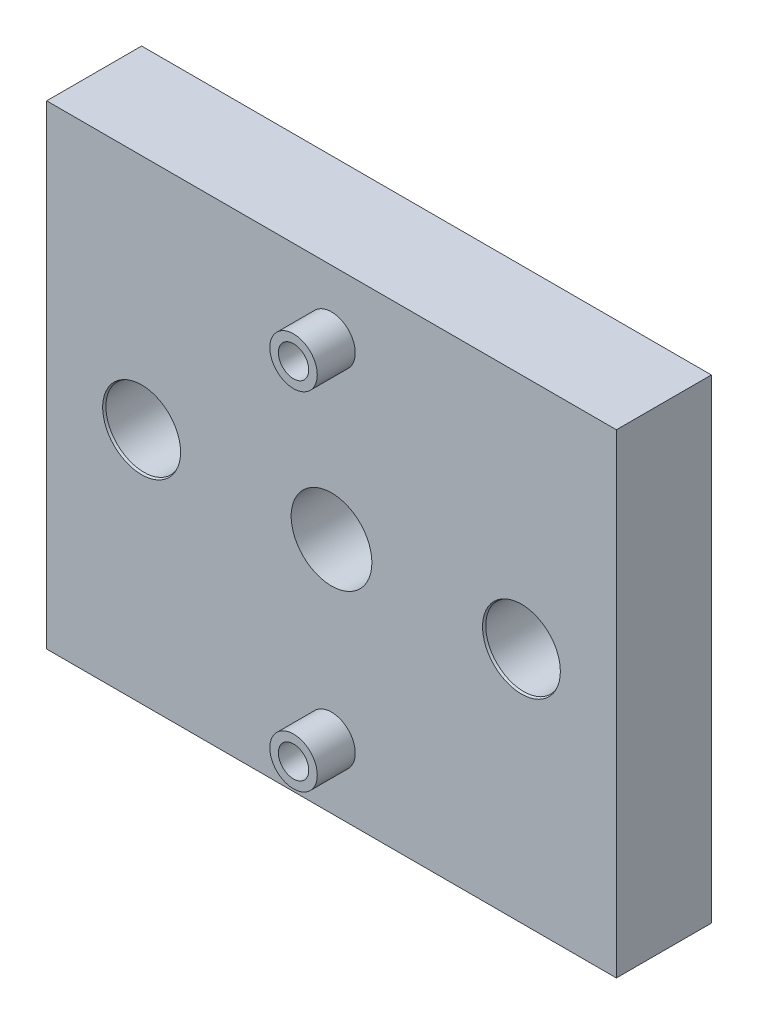
ISO-10303-21;
HEADER;
FILE_DESCRIPTION(('STEP AP214'),'2;1');
FILE_NAME('part.step','',(''),(''),'','','');
FILE_SCHEMA(('AUTOMOTIVE_DESIGN { 1 0 10303 214 1 1 1 1 }'));
ENDSEC;
DATA;
#1=APPLICATION_CONTEXT('core data for automotive mechanical design processes');
#2=APPLICATION_PROTOCOL_DEFINITION('international standard','automotive_design',2000,#1);
#3=PRODUCT_CONTEXT('',#1,'mechanical');
#4=PRODUCT('Part','Part','',(#3));
#5=PRODUCT_RELATED_PRODUCT_CATEGORY('part','',(#4));
#6=PRODUCT_DEFINITION_FORMATION('','',#4);
#7=PRODUCT_DEFINITION_CONTEXT('part definition',#1,'design');
#8=PRODUCT_DEFINITION('design','',#6,#7);
#9=PRODUCT_DEFINITION_SHAPE('','',#8);
#10=(LENGTH_UNIT() NAMED_UNIT(*) SI_UNIT(.MILLI.,.METRE.));
#11=(NAMED_UNIT(*) PLANE_ANGLE_UNIT() SI_UNIT($,.RADIAN.));
#12=(NAMED_UNIT(*) SI_UNIT($,.STERADIAN.) SOLID_ANGLE_UNIT());
#13=UNCERTAINTY_MEASURE_WITH_UNIT(LENGTH_MEASURE(1.E-05),#10,'distance_accuracy_value','');
#14=(GEOMETRIC_REPRESENTATION_CONTEXT(3) GLOBAL_UNCERTAINTY_ASSIGNED_CONTEXT((#13)) GLOBAL_UNIT_ASSIGNED_CONTEXT((#10,
#11,#12)) REPRESENTATION_CONTEXT('',''));
#15=CARTESIAN_POINT('',(0.,0.,0.));
#16=DIRECTION('',(0.,0.,1.));
#17=DIRECTION('',(1.,0.,0.));
#18=AXIS2_PLACEMENT_3D('',#15,#16,#17);
#19=CARTESIAN_POINT('',(30.,-25.,10.));
#20=DIRECTION('',(-1.,0.,0.));
#21=DIRECTION('',(0.,0.,1.));
#22=AXIS2_PLACEMENT_3D('',#19,#20,#21);
#23=PLANE('',#22);
#24=DIRECTION('',(0.,1.,0.));
#25=VECTOR('',#24,1.);
#26=CARTESIAN_POINT('',(30.,-25.,0.));
#27=LINE('',#26,#25);
#28=CARTESIAN_POINT('',(30.,-25.,0.));
#29=VERTEX_POINT('',#28);
#30=CARTESIAN_POINT('',(30.,25.,0.));
#31=VERTEX_POINT('',#30);
#32=EDGE_CURVE('E111',#29,#31,#27,.T.);
#33=ORIENTED_EDGE('',*,*,#32,.T.);
#34=DIRECTION('',(0.,0.,-1.));
#35=VECTOR('',#34,1.);
#36=CARTESIAN_POINT('',(30.,25.,10.));
#37=LINE('',#36,#35);
#38=CARTESIAN_POINT('',(30.,25.,10.));
#39=VERTEX_POINT('',#38);
#40=EDGE_CURVE('E100',#39,#31,#37,.T.);
#41=ORIENTED_EDGE('',*,*,#40,.F.);
#42=DIRECTION('',(0.,1.,0.));
#43=VECTOR('',#42,1.);
#44=CARTESIAN_POINT('',(30.,-25.,10.));
#45=LINE('',#44,#43);
#46=CARTESIAN_POINT('',(30.,-25.,10.));
#47=VERTEX_POINT('',#46);
#48=EDGE_CURVE('E92',#47,#39,#45,.T.);
#49=ORIENTED_EDGE('',*,*,#48,.F.);
#50=DIRECTION('',(0.,0.,-1.));
#51=VECTOR('',#50,1.);
#52=CARTESIAN_POINT('',(30.,-25.,10.));
#53=LINE('',#52,#51);
#54=EDGE_CURVE('E107',#47,#29,#53,.T.);
#55=ORIENTED_EDGE('',*,*,#54,.T.);
#56=EDGE_LOOP('',(#33,#41,#49,#55));
#57=FACE_BOUND('',#56,.T.);
#58=ADVANCED_FACE('F39',(#57),#23,.F.);
#59=CARTESIAN_POINT('',(-30.,25.,10.));
#60=DIRECTION('',(0.,-1.,0.));
#61=DIRECTION('',(0.,0.,-1.));
#62=AXIS2_PLACEMENT_3D('',#59,#60,#61);
#63=PLANE('',#62);
#64=DIRECTION('',(-1.,0.,0.));
#65=VECTOR('',#64,1.);
#66=CARTESIAN_POINT('',(-30.,25.,0.));
#67=LINE('',#66,#65);
#68=CARTESIAN_POINT('',(-30.,25.,0.));
#69=VERTEX_POINT('',#68);
#70=EDGE_CURVE('E98',#31,#69,#67,.T.);
#71=ORIENTED_EDGE('',*,*,#70,.T.);
#72=DIRECTION('',(0.,0.,-1.));
#73=VECTOR('',#72,1.);
#74=CARTESIAN_POINT('',(-30.,25.,10.));
#75=LINE('',#74,#73);
#76=CARTESIAN_POINT('',(-30.,25.,10.));
#77=VERTEX_POINT('',#76);
#78=EDGE_CURVE('E96',#77,#69,#75,.T.);
#79=ORIENTED_EDGE('',*,*,#78,.F.);
#80=DIRECTION('',(-1.,0.,0.));
#81=VECTOR('',#80,1.);
#82=CARTESIAN_POINT('',(-30.,25.,10.));
#83=LINE('',#82,#81);
#84=EDGE_CURVE('E87',#39,#77,#83,.T.);
#85=ORIENTED_EDGE('',*,*,#84,.F.);
#86=ORIENTED_EDGE('',*,*,#40,.T.);
#87=EDGE_LOOP('',(#71,#79,#85,#86));
#88=FACE_BOUND('',#87,.T.);
#89=ADVANCED_FACE('F97',(#88),#63,.F.);
#90=CARTESIAN_POINT('',(-30.,-25.,10.));
#91=DIRECTION('',(1.,0.,0.));
#92=DIRECTION('',(0.,0.,-1.));
#93=AXIS2_PLACEMENT_3D('',#90,#91,#92);
#94=PLANE('',#93);
#95=DIRECTION('',(0.,-1.,0.));
#96=VECTOR('',#95,1.);
#97=CARTESIAN_POINT('',(-30.,-25.,0.));
#98=LINE('',#97,#96);
#99=CARTESIAN_POINT('',(-30.,-25.,0.));
#100=VERTEX_POINT('',#99);
#101=EDGE_CURVE('E73',#69,#100,#98,.T.);
#102=ORIENTED_EDGE('',*,*,#101,.T.);
#103=DIRECTION('',(0.,0.,-1.));
#104=VECTOR('',#103,1.);
#105=CARTESIAN_POINT('',(-30.,-25.,10.));
#106=LINE('',#105,#104);
#107=CARTESIAN_POINT('',(-30.,-25.,10.));
#108=VERTEX_POINT('',#107);
#109=EDGE_CURVE('E101',#108,#100,#106,.T.);
#110=ORIENTED_EDGE('',*,*,#109,.F.);
#111=DIRECTION('',(0.,-1.,0.));
#112=VECTOR('',#111,1.);
#113=CARTESIAN_POINT('',(-30.,-25.,10.));
#114=LINE('',#113,#112);
#115=EDGE_CURVE('E90',#77,#108,#114,.T.);
#116=ORIENTED_EDGE('',*,*,#115,.F.);
#117=ORIENTED_EDGE('',*,*,#78,.T.);
#118=EDGE_LOOP('',(#102,#110,#116,#117));
#119=FACE_BOUND('',#118,.T.);
#120=ADVANCED_FACE('F103',(#119),#94,.F.);
#121=CARTESIAN_POINT('',(-30.,-25.,10.));
#122=DIRECTION('',(0.,1.,0.));
#123=DIRECTION('',(0.,0.,1.));
#124=AXIS2_PLACEMENT_3D('',#121,#122,#123);
#125=PLANE('',#124);
#126=DIRECTION('',(1.,0.,0.));
#127=VECTOR('',#126,1.);
#128=CARTESIAN_POINT('',(-30.,-25.,0.));
#129=LINE('',#128,#127);
#130=EDGE_CURVE('E79',#100,#29,#129,.T.);
#131=ORIENTED_EDGE('',*,*,#130,.T.);
#132=ORIENTED_EDGE('',*,*,#54,.F.);
#133=DIRECTION('',(1.,0.,0.));
#134=VECTOR('',#133,1.);
#135=CARTESIAN_POINT('',(-30.,-25.,10.));
#136=LINE('',#135,#134);
#137=EDGE_CURVE('E56',#108,#47,#136,.T.);
#138=ORIENTED_EDGE('',*,*,#137,.F.);
#139=ORIENTED_EDGE('',*,*,#109,.T.);
#140=EDGE_LOOP('',(#131,#132,#138,#139));
#141=FACE_BOUND('',#140,.T.);
#142=ADVANCED_FACE('F136',(#141),#125,.F.);
#143=CARTESIAN_POINT('',(0.,0.,10.));
#144=DIRECTION('',(0.,0.,-1.));
#145=DIRECTION('',(-1.,0.,0.));
#146=AXIS2_PLACEMENT_3D('',#143,#144,#145);
#147=PLANE('',#146);
#148=CARTESIAN_POINT('',(0.,-18.25,10.));
#149=DIRECTION('',(0.,0.,-1.));
#150=DIRECTION('',(-1.,0.,0.));
#151=AXIS2_PLACEMENT_3D('',#148,#149,#150);
#152=CIRCLE('',#151,2.5);
#153=CARTESIAN_POINT('',(-2.5,-18.25,10.));
#154=VERTEX_POINT('',#153);
#155=EDGE_CURVE('E11',#154,#154,#152,.F.);
#156=ORIENTED_EDGE('',*,*,#155,.F.);
#157=EDGE_LOOP('',(#156));
#158=FACE_BOUND('',#157,.T.);
#159=CARTESIAN_POINT('',(0.,18.25,10.));
#160=DIRECTION('',(0.,0.,-1.));
#161=DIRECTION('',(-1.,0.,0.));
#162=AXIS2_PLACEMENT_3D('',#159,#160,#161);
#163=CIRCLE('',#162,2.5);
#164=CARTESIAN_POINT('',(-2.5,18.25,10.));
#165=VERTEX_POINT('',#164);
#166=EDGE_CURVE('E48',#165,#165,#163,.F.);
#167=ORIENTED_EDGE('',*,*,#166,.F.);
#168=EDGE_LOOP('',(#167));
#169=FACE_BOUND('',#168,.T.);
#170=CARTESIAN_POINT('',(20.,0.,10.));
#171=DIRECTION('',(0.,0.,1.));
#172=DIRECTION('',(1.,0.,0.));
#173=AXIS2_PLACEMENT_3D('',#170,#171,#172);
#174=CIRCLE('',#173,4.1);
#175=CARTESIAN_POINT('',(24.1,0.,10.));
#176=VERTEX_POINT('',#175);
#177=EDGE_CURVE('E142',#176,#176,#174,.T.);
#178=ORIENTED_EDGE('',*,*,#177,.F.);
#179=EDGE_LOOP('',(#178));
#180=FACE_BOUND('',#179,.T.);
#181=CARTESIAN_POINT('',(-20.,0.,10.));
#182=DIRECTION('',(0.,0.,1.));
#183=DIRECTION('',(1.,0.,0.));
#184=AXIS2_PLACEMENT_3D('',#181,#182,#183);
#185=CIRCLE('',#184,4.1);
#186=CARTESIAN_POINT('',(-15.9,0.,10.));
#187=VERTEX_POINT('',#186);
#188=EDGE_CURVE('E146',#187,#187,#185,.T.);
#189=ORIENTED_EDGE('',*,*,#188,.F.);
#190=EDGE_LOOP('',(#189));
#191=FACE_BOUND('',#190,.T.);
#192=CARTESIAN_POINT('',(0.,0.,10.));
#193=DIRECTION('',(0.,0.,1.));
#194=DIRECTION('',(1.,0.,0.));
#195=AXIS2_PLACEMENT_3D('',#192,#193,#194);
#196=CIRCLE('',#195,4.25000000000002);
#197=CARTESIAN_POINT('',(4.25000000000002,0.,10.));
#198=VERTEX_POINT('',#197);
#199=EDGE_CURVE('E149',#198,#198,#196,.T.);
#200=ORIENTED_EDGE('',*,*,#199,.F.);
#201=EDGE_LOOP('',(#200));
#202=FACE_BOUND('',#201,.T.);
#203=ORIENTED_EDGE('',*,*,#48,.T.);
#204=ORIENTED_EDGE('',*,*,#84,.T.);
#205=ORIENTED_EDGE('',*,*,#115,.T.);
#206=ORIENTED_EDGE('',*,*,#137,.T.);
#207=EDGE_LOOP('',(#203,#204,#205,#206));
#208=FACE_BOUND('',#207,.T.);
#209=ADVANCED_FACE('F88',(#158,#169,#180,#191,#202,#208),#147,.F.);
#210=CARTESIAN_POINT('',(0.,0.,0.));
#211=DIRECTION('',(0.,0.,-1.));
#212=DIRECTION('',(-1.,0.,0.));
#213=AXIS2_PLACEMENT_3D('',#210,#211,#212);
#214=PLANE('',#213);
#215=CARTESIAN_POINT('',(0.,18.25,0.));
#216=DIRECTION('',(0.,0.,1.));
#217=DIRECTION('',(1.,0.,0.));
#218=AXIS2_PLACEMENT_3D('',#215,#216,#217);
#219=CIRCLE('',#218,1.60000000000001);
#220=CARTESIAN_POINT('',(1.60000000000001,18.25,0.));
#221=VERTEX_POINT('',#220);
#222=EDGE_CURVE('E194',#221,#221,#219,.T.);
#223=ORIENTED_EDGE('',*,*,#222,.T.);
#224=EDGE_LOOP('',(#223));
#225=FACE_BOUND('',#224,.T.);
#226=CARTESIAN_POINT('',(0.,-18.25,0.));
#227=DIRECTION('',(0.,0.,1.));
#228=DIRECTION('',(1.,0.,0.));
#229=AXIS2_PLACEMENT_3D('',#226,#227,#228);
#230=CIRCLE('',#229,1.60000000000001);
#231=CARTESIAN_POINT('',(1.60000000000001,-18.25,0.));
#232=VERTEX_POINT('',#231);
#233=EDGE_CURVE('E186',#232,#232,#230,.T.);
#234=ORIENTED_EDGE('',*,*,#233,.T.);
#235=EDGE_LOOP('',(#234));
#236=FACE_BOUND('',#235,.T.);
#237=CARTESIAN_POINT('',(20.,0.,0.));
#238=DIRECTION('',(0.,0.,1.));
#239=DIRECTION('',(1.,0.,0.));
#240=AXIS2_PLACEMENT_3D('',#237,#238,#239);
#241=CIRCLE('',#240,4.);
#242=CARTESIAN_POINT('',(24.,0.,0.));
#243=VERTEX_POINT('',#242);
#244=EDGE_CURVE('E168',#243,#243,#241,.T.);
#245=ORIENTED_EDGE('',*,*,#244,.T.);
#246=EDGE_LOOP('',(#245));
#247=FACE_BOUND('',#246,.T.);
#248=CARTESIAN_POINT('',(-20.,0.,0.));
#249=DIRECTION('',(0.,0.,1.));
#250=DIRECTION('',(1.,0.,0.));
#251=AXIS2_PLACEMENT_3D('',#248,#249,#250);
#252=CIRCLE('',#251,4.);
#253=CARTESIAN_POINT('',(-16.,0.,0.));
#254=VERTEX_POINT('',#253);
#255=EDGE_CURVE('E152',#254,#254,#252,.T.);
#256=ORIENTED_EDGE('',*,*,#255,.T.);
#257=EDGE_LOOP('',(#256));
#258=FACE_BOUND('',#257,.T.);
#259=CARTESIAN_POINT('',(0.,0.,0.));
#260=DIRECTION('',(0.,0.,-1.));
#261=DIRECTION('',(-1.,0.,0.));
#262=AXIS2_PLACEMENT_3D('',#259,#260,#261);
#263=CIRCLE('',#262,4.25000000000001);
#264=CARTESIAN_POINT('',(-4.25000000000001,0.,0.));
#265=VERTEX_POINT('',#264);
#266=EDGE_CURVE('E115',#265,#265,#263,.T.);
#267=ORIENTED_EDGE('',*,*,#266,.F.);
#268=EDGE_LOOP('',(#267));
#269=FACE_BOUND('',#268,.T.);
#270=ORIENTED_EDGE('',*,*,#32,.F.);
#271=ORIENTED_EDGE('',*,*,#130,.F.);
#272=ORIENTED_EDGE('',*,*,#101,.F.);
#273=ORIENTED_EDGE('',*,*,#70,.F.);
#274=EDGE_LOOP('',(#270,#271,#272,#273));
#275=FACE_BOUND('',#274,.T.);
#276=ADVANCED_FACE('F135',(#225,#236,#247,#258,#269,#275),#214,.T.);
#277=CARTESIAN_POINT('',(0.,0.,10.));
#278=DIRECTION('',(0.,0.,1.));
#279=DIRECTION('',(1.,0.,0.));
#280=AXIS2_PLACEMENT_3D('',#277,#278,#279);
#281=CYLINDRICAL_SURFACE('',#280,4.25000000000001);
#282=ORIENTED_EDGE('',*,*,#266,.T.);
#283=EDGE_LOOP('',(#282));
#284=FACE_BOUND('',#283,.T.);
#285=ORIENTED_EDGE('',*,*,#199,.T.);
#286=EDGE_LOOP('',(#285));
#287=FACE_BOUND('',#286,.T.);
#288=ADVANCED_FACE('F229',(#284,#287),#281,.F.);
#289=CARTESIAN_POINT('',(-20.,0.,10.));
#290=DIRECTION('',(0.,0.,1.));
#291=DIRECTION('',(1.,0.,0.));
#292=AXIS2_PLACEMENT_3D('',#289,#290,#291);
#293=CYLINDRICAL_SURFACE('',#292,4.00000000000001);
#294=ORIENTED_EDGE('',*,*,#255,.F.);
#295=EDGE_LOOP('',(#294));
#296=FACE_BOUND('',#295,.T.);
#297=CARTESIAN_POINT('',(-20.,0.,9.75857864376273));
#298=DIRECTION('',(0.,0.,1.));
#299=DIRECTION('',(1.,0.,0.));
#300=AXIS2_PLACEMENT_3D('',#297,#298,#299);
#301=CIRCLE('',#300,4.00000000000001);
#302=CARTESIAN_POINT('',(-16.,0.,9.75857864376273));
#303=VERTEX_POINT('',#302);
#304=EDGE_CURVE('E159',#303,#303,#301,.T.);
#305=ORIENTED_EDGE('',*,*,#304,.T.);
#306=EDGE_LOOP('',(#305));
#307=FACE_BOUND('',#306,.T.);
#308=ADVANCED_FACE('F235',(#296,#307),#293,.F.);
#309=CARTESIAN_POINT('',(-20.,0.,10.));
#310=DIRECTION('',(0.,0.,1.));
#311=DIRECTION('',(1.,0.,0.));
#312=AXIS2_PLACEMENT_3D('',#309,#310,#311);
#313=CONICAL_SURFACE('',#312,4.1,0.392699081698732);
#314=ORIENTED_EDGE('',*,*,#304,.F.);
#315=EDGE_LOOP('',(#314));
#316=FACE_BOUND('',#315,.T.);
#317=ORIENTED_EDGE('',*,*,#188,.T.);
#318=EDGE_LOOP('',(#317));
#319=FACE_BOUND('',#318,.T.);
#320=ADVANCED_FACE('F334',(#316,#319),#313,.F.);
#321=CARTESIAN_POINT('',(20.,0.,10.));
#322=DIRECTION('',(0.,0.,1.));
#323=DIRECTION('',(1.,0.,0.));
#324=AXIS2_PLACEMENT_3D('',#321,#322,#323);
#325=CYLINDRICAL_SURFACE('',#324,4.00000000000001);
#326=ORIENTED_EDGE('',*,*,#244,.F.);
#327=EDGE_LOOP('',(#326));
#328=FACE_BOUND('',#327,.T.);
#329=CARTESIAN_POINT('',(20.,0.,9.75857864376273));
#330=DIRECTION('',(0.,0.,1.));
#331=DIRECTION('',(1.,0.,0.));
#332=AXIS2_PLACEMENT_3D('',#329,#330,#331);
#333=CIRCLE('',#332,4.00000000000001);
#334=CARTESIAN_POINT('',(24.,0.,9.75857864376273));
#335=VERTEX_POINT('',#334);
#336=EDGE_CURVE('E172',#335,#335,#333,.T.);
#337=ORIENTED_EDGE('',*,*,#336,.T.);
#338=EDGE_LOOP('',(#337));
#339=FACE_BOUND('',#338,.T.);
#340=ADVANCED_FACE('F218',(#328,#339),#325,.F.);
#341=CARTESIAN_POINT('',(20.,0.,10.));
#342=DIRECTION('',(0.,0.,1.));
#343=DIRECTION('',(1.,0.,0.));
#344=AXIS2_PLACEMENT_3D('',#341,#342,#343);
#345=CONICAL_SURFACE('',#344,4.1,0.392699081698732);
#346=ORIENTED_EDGE('',*,*,#336,.F.);
#347=EDGE_LOOP('',(#346));
#348=FACE_BOUND('',#347,.T.);
#349=ORIENTED_EDGE('',*,*,#177,.T.);
#350=EDGE_LOOP('',(#349));
#351=FACE_BOUND('',#350,.T.);
#352=ADVANCED_FACE('F213',(#348,#351),#345,.F.);
#353=CARTESIAN_POINT('',(0.,18.25,14.));
#354=DIRECTION('',(0.,0.,-1.));
#355=DIRECTION('',(-1.,0.,0.));
#356=AXIS2_PLACEMENT_3D('',#353,#354,#355);
#357=CYLINDRICAL_SURFACE('',#356,2.5);
#358=CARTESIAN_POINT('',(0.,18.25,14.));
#359=DIRECTION('',(0.,0.,1.));
#360=DIRECTION('',(1.,0.,0.));
#361=AXIS2_PLACEMENT_3D('',#358,#359,#360);
#362=CIRCLE('',#361,2.5);
#363=CARTESIAN_POINT('',(2.5,18.25,14.));
#364=VERTEX_POINT('',#363);
#365=EDGE_CURVE('E178',#364,#364,#362,.T.);
#366=ORIENTED_EDGE('',*,*,#365,.F.);
#367=EDGE_LOOP('',(#366));
#368=FACE_BOUND('',#367,.T.);
#369=ORIENTED_EDGE('',*,*,#166,.T.);
#370=EDGE_LOOP('',(#369));
#371=FACE_BOUND('',#370,.T.);
#372=ADVANCED_FACE('F131',(#368,#371),#357,.T.);
#373=CARTESIAN_POINT('',(0.,18.25,14.));
#374=DIRECTION('',(0.,0.,1.));
#375=DIRECTION('',(1.,0.,0.));
#376=AXIS2_PLACEMENT_3D('',#373,#374,#375);
#377=PLANE('',#376);
#378=CARTESIAN_POINT('',(0.,18.25,14.));
#379=DIRECTION('',(0.,0.,1.));
#380=DIRECTION('',(1.,0.,0.));
#381=AXIS2_PLACEMENT_3D('',#378,#379,#380);
#382=CIRCLE('',#381,1.60000000000001);
#383=CARTESIAN_POINT('',(1.60000000000001,18.25,14.));
#384=VERTEX_POINT('',#383);
#385=EDGE_CURVE('E198',#384,#384,#382,.T.);
#386=ORIENTED_EDGE('',*,*,#385,.F.);
#387=EDGE_LOOP('',(#386));
#388=FACE_BOUND('',#387,.T.);
#389=ORIENTED_EDGE('',*,*,#365,.T.);
#390=EDGE_LOOP('',(#389));
#391=FACE_BOUND('',#390,.T.);
#392=ADVANCED_FACE('F205',(#388,#391),#377,.T.);
#393=CARTESIAN_POINT('',(0.,-18.25,14.));
#394=DIRECTION('',(0.,0.,-1.));
#395=DIRECTION('',(-1.,0.,0.));
#396=AXIS2_PLACEMENT_3D('',#393,#394,#395);
#397=CYLINDRICAL_SURFACE('',#396,2.5);
#398=CARTESIAN_POINT('',(0.,-18.25,14.));
#399=DIRECTION('',(0.,0.,1.));
#400=DIRECTION('',(1.,0.,0.));
#401=AXIS2_PLACEMENT_3D('',#398,#399,#400);
#402=CIRCLE('',#401,2.5);
#403=CARTESIAN_POINT('',(2.5,-18.25,14.));
#404=VERTEX_POINT('',#403);
#405=EDGE_CURVE('E182',#404,#404,#402,.T.);
#406=ORIENTED_EDGE('',*,*,#405,.F.);
#407=EDGE_LOOP('',(#406));
#408=FACE_BOUND('',#407,.T.);
#409=ORIENTED_EDGE('',*,*,#155,.T.);
#410=EDGE_LOOP('',(#409));
#411=FACE_BOUND('',#410,.T.);
#412=ADVANCED_FACE('F208',(#408,#411),#397,.T.);
#413=CARTESIAN_POINT('',(0.,-18.25,14.));
#414=DIRECTION('',(0.,0.,1.));
#415=DIRECTION('',(1.,0.,0.));
#416=AXIS2_PLACEMENT_3D('',#413,#414,#415);
#417=PLANE('',#416);
#418=CARTESIAN_POINT('',(0.,-18.25,14.));
#419=DIRECTION('',(0.,0.,1.));
#420=DIRECTION('',(1.,0.,0.));
#421=AXIS2_PLACEMENT_3D('',#418,#419,#420);
#422=CIRCLE('',#421,1.60000000000001);
#423=CARTESIAN_POINT('',(1.60000000000001,-18.25,14.));
#424=VERTEX_POINT('',#423);
#425=EDGE_CURVE('E190',#424,#424,#422,.T.);
#426=ORIENTED_EDGE('',*,*,#425,.F.);
#427=EDGE_LOOP('',(#426));
#428=FACE_BOUND('',#427,.T.);
#429=ORIENTED_EDGE('',*,*,#405,.T.);
#430=EDGE_LOOP('',(#429));
#431=FACE_BOUND('',#430,.T.);
#432=ADVANCED_FACE('F274',(#428,#431),#417,.T.);
#433=CARTESIAN_POINT('',(0.,-18.25,14.));
#434=DIRECTION('',(0.,0.,1.));
#435=DIRECTION('',(1.,0.,0.));
#436=AXIS2_PLACEMENT_3D('',#433,#434,#435);
#437=CYLINDRICAL_SURFACE('',#436,1.60000000000001);
#438=ORIENTED_EDGE('',*,*,#233,.F.);
#439=EDGE_LOOP('',(#438));
#440=FACE_BOUND('',#439,.T.);
#441=ORIENTED_EDGE('',*,*,#425,.T.);
#442=EDGE_LOOP('',(#441));
#443=FACE_BOUND('',#442,.T.);
#444=ADVANCED_FACE('F294',(#440,#443),#437,.F.);
#445=CARTESIAN_POINT('',(0.,18.25,14.));
#446=DIRECTION('',(0.,0.,1.));
#447=DIRECTION('',(1.,0.,0.));
#448=AXIS2_PLACEMENT_3D('',#445,#446,#447);
#449=CYLINDRICAL_SURFACE('',#448,1.60000000000001);
#450=ORIENTED_EDGE('',*,*,#222,.F.);
#451=EDGE_LOOP('',(#450));
#452=FACE_BOUND('',#451,.T.);
#453=ORIENTED_EDGE('',*,*,#385,.T.);
#454=EDGE_LOOP('',(#453));
#455=FACE_BOUND('',#454,.T.);
#456=ADVANCED_FACE('F203',(#452,#455),#449,.F.);
#457=CLOSED_SHELL('',(#58,#89,#120,#142,#209,#276,#288,#308,#320,#340,#352,#372,#392,#412,#432,
#444,#456));
#458=MANIFOLD_SOLID_BREP('B2',#457);
#459=ADVANCED_BREP_SHAPE_REPRESENTATION('',(#18,#458),#14);
#460=SHAPE_DEFINITION_REPRESENTATION(#9,#459);
ENDSEC;
END-ISO-10303-21;
